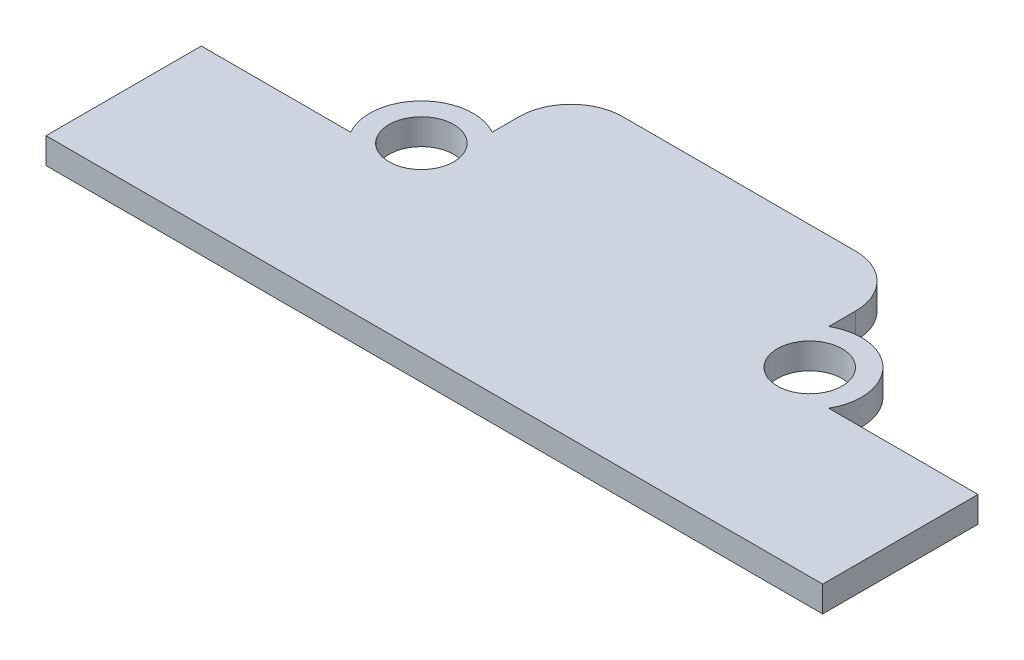
ISO-10303-21;
HEADER;
FILE_DESCRIPTION(('STEP AP214'),'2;1');
FILE_NAME('part.step','',(''),(''),'','','');
FILE_SCHEMA(('AUTOMOTIVE_DESIGN { 1 0 10303 214 1 1 1 1 }'));
ENDSEC;
DATA;
#1=APPLICATION_CONTEXT('core data for automotive mechanical design processes');
#2=APPLICATION_PROTOCOL_DEFINITION('international standard','automotive_design',2000,#1);
#3=PRODUCT_CONTEXT('',#1,'mechanical');
#4=PRODUCT('Part','Part','',(#3));
#5=PRODUCT_RELATED_PRODUCT_CATEGORY('part','',(#4));
#6=PRODUCT_DEFINITION_FORMATION('','',#4);
#7=PRODUCT_DEFINITION_CONTEXT('part definition',#1,'design');
#8=PRODUCT_DEFINITION('design','',#6,#7);
#9=PRODUCT_DEFINITION_SHAPE('','',#8);
#10=(LENGTH_UNIT() NAMED_UNIT(*) SI_UNIT(.MILLI.,.METRE.));
#11=(NAMED_UNIT(*) PLANE_ANGLE_UNIT() SI_UNIT($,.RADIAN.));
#12=(NAMED_UNIT(*) SI_UNIT($,.STERADIAN.) SOLID_ANGLE_UNIT());
#13=UNCERTAINTY_MEASURE_WITH_UNIT(LENGTH_MEASURE(1.E-05),#10,'distance_accuracy_value','');
#14=(GEOMETRIC_REPRESENTATION_CONTEXT(3) GLOBAL_UNCERTAINTY_ASSIGNED_CONTEXT((#13)) GLOBAL_UNIT_ASSIGNED_CONTEXT((#10,
#11,#12)) REPRESENTATION_CONTEXT('',''));
#15=CARTESIAN_POINT('',(0.,0.,0.));
#16=DIRECTION('',(0.,0.,1.));
#17=DIRECTION('',(1.,0.,0.));
#18=AXIS2_PLACEMENT_3D('',#15,#16,#17);
#19=CARTESIAN_POINT('',(0.,1.,0.));
#20=DIRECTION('',(1.,0.,0.));
#21=DIRECTION('',(0.,0.,-1.));
#22=AXIS2_PLACEMENT_3D('',#19,#20,#21);
#23=PLANE('',#22);
#24=DIRECTION('',(0.,0.,1.));
#25=VECTOR('',#24,1.);
#26=CARTESIAN_POINT('',(0.,0.,0.));
#27=LINE('',#26,#25);
#28=CARTESIAN_POINT('',(0.,0.,-6.));
#29=VERTEX_POINT('',#28);
#30=CARTESIAN_POINT('',(0.,0.,0.));
#31=VERTEX_POINT('',#30);
#32=EDGE_CURVE('E213',#29,#31,#27,.T.);
#33=ORIENTED_EDGE('',*,*,#32,.T.);
#34=DIRECTION('',(0.,-1.,0.));
#35=VECTOR('',#34,1.);
#36=CARTESIAN_POINT('',(0.,1.,0.));
#37=LINE('',#36,#35);
#38=CARTESIAN_POINT('',(0.,1.,0.));
#39=VERTEX_POINT('',#38);
#40=EDGE_CURVE('E174',#39,#31,#37,.T.);
#41=ORIENTED_EDGE('',*,*,#40,.F.);
#42=DIRECTION('',(0.,0.,1.));
#43=VECTOR('',#42,1.);
#44=CARTESIAN_POINT('',(0.,1.,0.));
#45=LINE('',#44,#43);
#46=CARTESIAN_POINT('',(0.,1.,-6.));
#47=VERTEX_POINT('',#46);
#48=EDGE_CURVE('E165',#47,#39,#45,.T.);
#49=ORIENTED_EDGE('',*,*,#48,.F.);
#50=DIRECTION('',(0.,-1.,0.));
#51=VECTOR('',#50,1.);
#52=CARTESIAN_POINT('',(0.,1.,-6.));
#53=LINE('',#52,#51);
#54=EDGE_CURVE('E166',#47,#29,#53,.T.);
#55=ORIENTED_EDGE('',*,*,#54,.T.);
#56=EDGE_LOOP('',(#33,#41,#49,#55));
#57=FACE_BOUND('',#56,.T.);
#58=ADVANCED_FACE('F33',(#57),#23,.F.);
#59=CARTESIAN_POINT('',(0.,1.,0.));
#60=DIRECTION('',(0.,0.,-1.));
#61=DIRECTION('',(-1.,0.,0.));
#62=AXIS2_PLACEMENT_3D('',#59,#60,#61);
#63=PLANE('',#62);
#64=DIRECTION('',(1.,0.,0.));
#65=VECTOR('',#64,1.);
#66=CARTESIAN_POINT('',(0.,0.,0.));
#67=LINE('',#66,#65);
#68=CARTESIAN_POINT('',(30.,0.,0.));
#69=VERTEX_POINT('',#68);
#70=EDGE_CURVE('E155',#31,#69,#67,.T.);
#71=ORIENTED_EDGE('',*,*,#70,.T.);
#72=DIRECTION('',(0.,-1.,0.));
#73=VECTOR('',#72,1.);
#74=CARTESIAN_POINT('',(30.,1.,0.));
#75=LINE('',#74,#73);
#76=CARTESIAN_POINT('',(30.,1.,0.));
#77=VERTEX_POINT('',#76);
#78=EDGE_CURVE('E171',#77,#69,#75,.T.);
#79=ORIENTED_EDGE('',*,*,#78,.F.);
#80=DIRECTION('',(1.,0.,0.));
#81=VECTOR('',#80,1.);
#82=CARTESIAN_POINT('',(0.,1.,0.));
#83=LINE('',#82,#81);
#84=EDGE_CURVE('E216',#39,#77,#83,.T.);
#85=ORIENTED_EDGE('',*,*,#84,.F.);
#86=ORIENTED_EDGE('',*,*,#40,.T.);
#87=EDGE_LOOP('',(#71,#79,#85,#86));
#88=FACE_BOUND('',#87,.T.);
#89=ADVANCED_FACE('F228',(#88),#63,.F.);
#90=CARTESIAN_POINT('',(30.,1.,0.));
#91=DIRECTION('',(-1.,0.,0.));
#92=DIRECTION('',(0.,0.,1.));
#93=AXIS2_PLACEMENT_3D('',#90,#91,#92);
#94=PLANE('',#93);
#95=DIRECTION('',(0.,0.,-1.));
#96=VECTOR('',#95,1.);
#97=CARTESIAN_POINT('',(30.,0.,0.));
#98=LINE('',#97,#96);
#99=CARTESIAN_POINT('',(30.,0.,-6.));
#100=VERTEX_POINT('',#99);
#101=EDGE_CURVE('E151',#69,#100,#98,.T.);
#102=ORIENTED_EDGE('',*,*,#101,.T.);
#103=DIRECTION('',(0.,-1.,0.));
#104=VECTOR('',#103,1.);
#105=CARTESIAN_POINT('',(30.,1.,-6.));
#106=LINE('',#105,#104);
#107=CARTESIAN_POINT('',(30.,1.,-6.));
#108=VERTEX_POINT('',#107);
#109=EDGE_CURVE('E150',#108,#100,#106,.T.);
#110=ORIENTED_EDGE('',*,*,#109,.F.);
#111=DIRECTION('',(0.,0.,-1.));
#112=VECTOR('',#111,1.);
#113=CARTESIAN_POINT('',(30.,1.,0.));
#114=LINE('',#113,#112);
#115=EDGE_CURVE('E218',#77,#108,#114,.T.);
#116=ORIENTED_EDGE('',*,*,#115,.F.);
#117=ORIENTED_EDGE('',*,*,#78,.T.);
#118=EDGE_LOOP('',(#102,#110,#116,#117));
#119=FACE_BOUND('',#118,.T.);
#120=ADVANCED_FACE('F233',(#119),#94,.F.);
#121=CARTESIAN_POINT('',(21.5,1.,-6.));
#122=DIRECTION('',(0.,0.,1.));
#123=DIRECTION('',(1.,0.,0.));
#124=AXIS2_PLACEMENT_3D('',#121,#122,#123);
#125=PLANE('',#124);
#126=DIRECTION('',(-1.,0.,0.));
#127=VECTOR('',#126,1.);
#128=CARTESIAN_POINT('',(21.5,0.,-6.));
#129=LINE('',#128,#127);
#130=CARTESIAN_POINT('',(24.2320508075689,0.,-6.));
#131=VERTEX_POINT('',#130);
#132=EDGE_CURVE('E144',#100,#131,#129,.T.);
#133=ORIENTED_EDGE('',*,*,#132,.T.);
#134=DIRECTION('',(0.,1.,0.));
#135=VECTOR('',#134,1.);
#136=CARTESIAN_POINT('',(24.2320508075689,0.,-6.));
#137=LINE('',#136,#135);
#138=CARTESIAN_POINT('',(24.2320508075689,1.,-6.));
#139=VERTEX_POINT('',#138);
#140=EDGE_CURVE('E124',#131,#139,#137,.T.);
#141=ORIENTED_EDGE('',*,*,#140,.T.);
#142=DIRECTION('',(-1.,0.,0.));
#143=VECTOR('',#142,1.);
#144=CARTESIAN_POINT('',(21.5,1.,-6.));
#145=LINE('',#144,#143);
#146=EDGE_CURVE('E220',#108,#139,#145,.T.);
#147=ORIENTED_EDGE('',*,*,#146,.F.);
#148=ORIENTED_EDGE('',*,*,#109,.T.);
#149=EDGE_LOOP('',(#133,#141,#147,#148));
#150=FACE_BOUND('',#149,.T.);
#151=ADVANCED_FACE('F148',(#150),#125,.F.);
#152=CARTESIAN_POINT('',(21.5,1.,-6.));
#153=DIRECTION('',(-1.,0.,0.));
#154=DIRECTION('',(0.,0.,1.));
#155=AXIS2_PLACEMENT_3D('',#152,#153,#154);
#156=PLANE('',#155);
#157=DIRECTION('',(0.,0.,-1.));
#158=VECTOR('',#157,1.);
#159=CARTESIAN_POINT('',(21.5,0.,-6.));
#160=LINE('',#159,#158);
#161=CARTESIAN_POINT('',(21.5,0.,-8.73205080756888));
#162=VERTEX_POINT('',#161);
#163=CARTESIAN_POINT('',(21.5,0.,-9.77501932466479));
#164=VERTEX_POINT('',#163);
#165=EDGE_CURVE('E145',#162,#164,#160,.T.);
#166=ORIENTED_EDGE('',*,*,#165,.T.);
#167=DIRECTION('',(0.,-1.,0.));
#168=VECTOR('',#167,1.);
#169=CARTESIAN_POINT('',(21.5,1.,-9.77501932466479));
#170=LINE('',#169,#168);
#171=CARTESIAN_POINT('',(21.5,1.,-9.77501932466479));
#172=VERTEX_POINT('',#171);
#173=EDGE_CURVE('E56',#164,#172,#170,.F.);
#174=ORIENTED_EDGE('',*,*,#173,.T.);
#175=DIRECTION('',(0.,0.,-1.));
#176=VECTOR('',#175,1.);
#177=CARTESIAN_POINT('',(21.5,1.,-6.));
#178=LINE('',#177,#176);
#179=CARTESIAN_POINT('',(21.5,1.,-8.73205080756888));
#180=VERTEX_POINT('',#179);
#181=EDGE_CURVE('E191',#180,#172,#178,.T.);
#182=ORIENTED_EDGE('',*,*,#181,.F.);
#183=DIRECTION('',(0.,1.,0.));
#184=VECTOR('',#183,1.);
#185=CARTESIAN_POINT('',(21.5,0.,-8.73205080756888));
#186=LINE('',#185,#184);
#187=EDGE_CURVE('E136',#180,#162,#186,.F.);
#188=ORIENTED_EDGE('',*,*,#187,.T.);
#189=EDGE_LOOP('',(#166,#174,#182,#188));
#190=FACE_BOUND('',#189,.T.);
#191=ADVANCED_FACE('F200',(#190),#156,.F.);
#192=CARTESIAN_POINT('',(8.5,1.,-11.7750193246648));
#193=DIRECTION('',(0.,0.,1.));
#194=DIRECTION('',(1.,0.,0.));
#195=AXIS2_PLACEMENT_3D('',#192,#193,#194);
#196=PLANE('',#195);
#197=DIRECTION('',(-1.,0.,0.));
#198=VECTOR('',#197,1.);
#199=CARTESIAN_POINT('',(8.5,1.,-11.7750193246648));
#200=LINE('',#199,#198);
#201=CARTESIAN_POINT('',(19.5,1.,-11.7750193246648));
#202=VERTEX_POINT('',#201);
#203=CARTESIAN_POINT('',(10.5,1.,-11.7750193246648));
#204=VERTEX_POINT('',#203);
#205=EDGE_CURVE('E190',#202,#204,#200,.T.);
#206=ORIENTED_EDGE('',*,*,#205,.F.);
#207=DIRECTION('',(0.,-1.,0.));
#208=VECTOR('',#207,1.);
#209=CARTESIAN_POINT('',(19.5,1.,-11.7750193246648));
#210=LINE('',#209,#208);
#211=CARTESIAN_POINT('',(19.5,0.,-11.7750193246648));
#212=VERTEX_POINT('',#211);
#213=EDGE_CURVE('E179',#202,#212,#210,.T.);
#214=ORIENTED_EDGE('',*,*,#213,.T.);
#215=DIRECTION('',(-1.,0.,0.));
#216=VECTOR('',#215,1.);
#217=CARTESIAN_POINT('',(8.5,0.,-11.7750193246648));
#218=LINE('',#217,#216);
#219=CARTESIAN_POINT('',(10.5,0.,-11.7750193246648));
#220=VERTEX_POINT('',#219);
#221=EDGE_CURVE('E153',#212,#220,#218,.T.);
#222=ORIENTED_EDGE('',*,*,#221,.T.);
#223=DIRECTION('',(0.,-1.,0.));
#224=VECTOR('',#223,1.);
#225=CARTESIAN_POINT('',(10.5,1.,-11.7750193246648));
#226=LINE('',#225,#224);
#227=EDGE_CURVE('E177',#220,#204,#226,.F.);
#228=ORIENTED_EDGE('',*,*,#227,.T.);
#229=EDGE_LOOP('',(#206,#214,#222,#228));
#230=FACE_BOUND('',#229,.T.);
#231=ADVANCED_FACE('F195',(#230),#196,.F.);
#232=CARTESIAN_POINT('',(8.5,1.,-6.));
#233=DIRECTION('',(1.,0.,0.));
#234=DIRECTION('',(0.,0.,-1.));
#235=AXIS2_PLACEMENT_3D('',#232,#233,#234);
#236=PLANE('',#235);
#237=DIRECTION('',(0.,0.,1.));
#238=VECTOR('',#237,1.);
#239=CARTESIAN_POINT('',(8.5,1.,-6.));
#240=LINE('',#239,#238);
#241=CARTESIAN_POINT('',(8.5,1.,-9.77501932466479));
#242=VERTEX_POINT('',#241);
#243=CARTESIAN_POINT('',(8.5,1.,-8.73205080756887));
#244=VERTEX_POINT('',#243);
#245=EDGE_CURVE('E197',#242,#244,#240,.T.);
#246=ORIENTED_EDGE('',*,*,#245,.F.);
#247=DIRECTION('',(0.,-1.,0.));
#248=VECTOR('',#247,1.);
#249=CARTESIAN_POINT('',(8.5,1.,-9.77501932466479));
#250=LINE('',#249,#248);
#251=CARTESIAN_POINT('',(8.5,0.,-9.77501932466479));
#252=VERTEX_POINT('',#251);
#253=EDGE_CURVE('E11',#242,#252,#250,.T.);
#254=ORIENTED_EDGE('',*,*,#253,.T.);
#255=DIRECTION('',(0.,0.,1.));
#256=VECTOR('',#255,1.);
#257=CARTESIAN_POINT('',(8.5,0.,-6.));
#258=LINE('',#257,#256);
#259=CARTESIAN_POINT('',(8.5,0.,-8.73205080756887));
#260=VERTEX_POINT('',#259);
#261=EDGE_CURVE('E161',#252,#260,#258,.T.);
#262=ORIENTED_EDGE('',*,*,#261,.T.);
#263=DIRECTION('',(0.,1.,0.));
#264=VECTOR('',#263,1.);
#265=CARTESIAN_POINT('',(8.5,0.,-8.73205080756887));
#266=LINE('',#265,#264);
#267=EDGE_CURVE('E210',#260,#244,#266,.T.);
#268=ORIENTED_EDGE('',*,*,#267,.T.);
#269=EDGE_LOOP('',(#246,#254,#262,#268));
#270=FACE_BOUND('',#269,.T.);
#271=ADVANCED_FACE('F249',(#270),#236,.F.);
#272=CARTESIAN_POINT('',(0.,1.,-6.));
#273=DIRECTION('',(0.,0.,1.));
#274=DIRECTION('',(1.,0.,0.));
#275=AXIS2_PLACEMENT_3D('',#272,#273,#274);
#276=PLANE('',#275);
#277=DIRECTION('',(-1.,0.,0.));
#278=VECTOR('',#277,1.);
#279=CARTESIAN_POINT('',(0.,1.,-6.));
#280=LINE('',#279,#278);
#281=CARTESIAN_POINT('',(5.76794919243112,1.,-6.));
#282=VERTEX_POINT('',#281);
#283=EDGE_CURVE('E169',#282,#47,#280,.T.);
#284=ORIENTED_EDGE('',*,*,#283,.F.);
#285=DIRECTION('',(0.,1.,0.));
#286=VECTOR('',#285,1.);
#287=CARTESIAN_POINT('',(5.76794919243112,0.,-6.));
#288=LINE('',#287,#286);
#289=CARTESIAN_POINT('',(5.76794919243112,0.,-6.));
#290=VERTEX_POINT('',#289);
#291=EDGE_CURVE('E206',#282,#290,#288,.F.);
#292=ORIENTED_EDGE('',*,*,#291,.T.);
#293=DIRECTION('',(-1.,0.,0.));
#294=VECTOR('',#293,1.);
#295=CARTESIAN_POINT('',(0.,0.,-6.));
#296=LINE('',#295,#294);
#297=EDGE_CURVE('E163',#290,#29,#296,.T.);
#298=ORIENTED_EDGE('',*,*,#297,.T.);
#299=ORIENTED_EDGE('',*,*,#54,.F.);
#300=EDGE_LOOP('',(#284,#292,#298,#299));
#301=FACE_BOUND('',#300,.T.);
#302=ADVANCED_FACE('F242',(#301),#276,.F.);
#303=CARTESIAN_POINT('',(0.,1.,0.));
#304=DIRECTION('',(0.,-1.,0.));
#305=DIRECTION('',(0.,0.,-1.));
#306=AXIS2_PLACEMENT_3D('',#303,#304,#305);
#307=PLANE('',#306);
#308=CARTESIAN_POINT('',(22.5,1.,-7.));
#309=DIRECTION('',(0.,1.,0.));
#310=DIRECTION('',(0.,0.,1.));
#311=AXIS2_PLACEMENT_3D('',#308,#309,#310);
#312=CIRCLE('',#311,1.25);
#313=CARTESIAN_POINT('',(22.5,1.,-5.75));
#314=VERTEX_POINT('',#313);
#315=EDGE_CURVE('E300',#314,#314,#312,.T.);
#316=ORIENTED_EDGE('',*,*,#315,.F.);
#317=EDGE_LOOP('',(#316));
#318=FACE_BOUND('',#317,.T.);
#319=CARTESIAN_POINT('',(7.5,1.,-7.));
#320=DIRECTION('',(0.,1.,0.));
#321=DIRECTION('',(0.,0.,1.));
#322=AXIS2_PLACEMENT_3D('',#319,#320,#321);
#323=CIRCLE('',#322,1.25);
#324=CARTESIAN_POINT('',(7.5,1.,-5.75));
#325=VERTEX_POINT('',#324);
#326=EDGE_CURVE('E302',#325,#325,#323,.T.);
#327=ORIENTED_EDGE('',*,*,#326,.F.);
#328=EDGE_LOOP('',(#327));
#329=FACE_BOUND('',#328,.T.);
#330=ORIENTED_EDGE('',*,*,#181,.T.);
#331=CARTESIAN_POINT('',(19.5,1.,-9.77501932466479));
#332=DIRECTION('',(0.,-1.,0.));
#333=DIRECTION('',(0.,0.,-1.));
#334=AXIS2_PLACEMENT_3D('',#331,#332,#333);
#335=CIRCLE('',#334,2.);
#336=EDGE_CURVE('E41',#172,#202,#335,.F.);
#337=ORIENTED_EDGE('',*,*,#336,.T.);
#338=ORIENTED_EDGE('',*,*,#205,.T.);
#339=CARTESIAN_POINT('',(10.5,1.,-9.77501932466479));
#340=DIRECTION('',(0.,-1.,0.));
#341=DIRECTION('',(0.,0.,-1.));
#342=AXIS2_PLACEMENT_3D('',#339,#340,#341);
#343=CIRCLE('',#342,2.);
#344=EDGE_CURVE('E48',#204,#242,#343,.F.);
#345=ORIENTED_EDGE('',*,*,#344,.T.);
#346=ORIENTED_EDGE('',*,*,#245,.T.);
#347=CARTESIAN_POINT('',(7.5,1.,-7.));
#348=DIRECTION('',(0.,1.,0.));
#349=DIRECTION('',(0.,0.,1.));
#350=AXIS2_PLACEMENT_3D('',#347,#348,#349);
#351=CIRCLE('',#350,2.);
#352=EDGE_CURVE('E135',#244,#282,#351,.T.);
#353=ORIENTED_EDGE('',*,*,#352,.T.);
#354=ORIENTED_EDGE('',*,*,#283,.T.);
#355=ORIENTED_EDGE('',*,*,#48,.T.);
#356=ORIENTED_EDGE('',*,*,#84,.T.);
#357=ORIENTED_EDGE('',*,*,#115,.T.);
#358=ORIENTED_EDGE('',*,*,#146,.T.);
#359=CARTESIAN_POINT('',(22.5,1.,-7.));
#360=DIRECTION('',(0.,1.,0.));
#361=DIRECTION('',(0.,0.,1.));
#362=AXIS2_PLACEMENT_3D('',#359,#360,#361);
#363=CIRCLE('',#362,2.);
#364=EDGE_CURVE('E130',#139,#180,#363,.T.);
#365=ORIENTED_EDGE('',*,*,#364,.T.);
#366=EDGE_LOOP('',(#330,#337,#338,#345,#346,#353,#354,#355,#356,#357,#358,#365));
#367=FACE_BOUND('',#366,.T.);
#368=ADVANCED_FACE('F189',(#318,#329,#367),#307,.F.);
#369=CARTESIAN_POINT('',(0.,0.,0.));
#370=DIRECTION('',(0.,-1.,0.));
#371=DIRECTION('',(0.,0.,-1.));
#372=AXIS2_PLACEMENT_3D('',#369,#370,#371);
#373=PLANE('',#372);
#374=CARTESIAN_POINT('',(22.5,0.,-7.));
#375=DIRECTION('',(0.,1.,0.));
#376=DIRECTION('',(0.,0.,1.));
#377=AXIS2_PLACEMENT_3D('',#374,#375,#376);
#378=CIRCLE('',#377,1.25);
#379=CARTESIAN_POINT('',(22.5,0.,-5.75));
#380=VERTEX_POINT('',#379);
#381=EDGE_CURVE('E297',#380,#380,#378,.T.);
#382=ORIENTED_EDGE('',*,*,#381,.T.);
#383=EDGE_LOOP('',(#382));
#384=FACE_BOUND('',#383,.T.);
#385=CARTESIAN_POINT('',(7.5,0.,-7.));
#386=DIRECTION('',(0.,1.,0.));
#387=DIRECTION('',(0.,0.,1.));
#388=AXIS2_PLACEMENT_3D('',#385,#386,#387);
#389=CIRCLE('',#388,1.25);
#390=CARTESIAN_POINT('',(7.5,0.,-5.75));
#391=VERTEX_POINT('',#390);
#392=EDGE_CURVE('E305',#391,#391,#389,.T.);
#393=ORIENTED_EDGE('',*,*,#392,.T.);
#394=EDGE_LOOP('',(#393));
#395=FACE_BOUND('',#394,.T.);
#396=ORIENTED_EDGE('',*,*,#221,.F.);
#397=CARTESIAN_POINT('',(19.5,0.,-9.77501932466479));
#398=DIRECTION('',(0.,-1.,0.));
#399=DIRECTION('',(0.,0.,-1.));
#400=AXIS2_PLACEMENT_3D('',#397,#398,#399);
#401=CIRCLE('',#400,2.);
#402=EDGE_CURVE('E184',#212,#164,#401,.T.);
#403=ORIENTED_EDGE('',*,*,#402,.T.);
#404=ORIENTED_EDGE('',*,*,#165,.F.);
#405=CARTESIAN_POINT('',(22.5,0.,-7.));
#406=DIRECTION('',(0.,1.,0.));
#407=DIRECTION('',(0.,0.,1.));
#408=AXIS2_PLACEMENT_3D('',#405,#406,#407);
#409=CIRCLE('',#408,2.);
#410=EDGE_CURVE('E128',#131,#162,#409,.T.);
#411=ORIENTED_EDGE('',*,*,#410,.F.);
#412=ORIENTED_EDGE('',*,*,#132,.F.);
#413=ORIENTED_EDGE('',*,*,#101,.F.);
#414=ORIENTED_EDGE('',*,*,#70,.F.);
#415=ORIENTED_EDGE('',*,*,#32,.F.);
#416=ORIENTED_EDGE('',*,*,#297,.F.);
#417=CARTESIAN_POINT('',(7.5,0.,-7.));
#418=DIRECTION('',(0.,1.,0.));
#419=DIRECTION('',(0.,0.,1.));
#420=AXIS2_PLACEMENT_3D('',#417,#418,#419);
#421=CIRCLE('',#420,2.);
#422=EDGE_CURVE('E204',#260,#290,#421,.T.);
#423=ORIENTED_EDGE('',*,*,#422,.F.);
#424=ORIENTED_EDGE('',*,*,#261,.F.);
#425=CARTESIAN_POINT('',(10.5,0.,-9.77501932466479));
#426=DIRECTION('',(0.,-1.,0.));
#427=DIRECTION('',(0.,0.,-1.));
#428=AXIS2_PLACEMENT_3D('',#425,#426,#427);
#429=CIRCLE('',#428,2.);
#430=EDGE_CURVE('E182',#252,#220,#429,.T.);
#431=ORIENTED_EDGE('',*,*,#430,.T.);
#432=EDGE_LOOP('',(#396,#403,#404,#411,#412,#413,#414,#415,#416,#423,#424,#431));
#433=FACE_BOUND('',#432,.T.);
#434=ADVANCED_FACE('F142',(#384,#395,#433),#373,.T.);
#435=CARTESIAN_POINT('',(7.5,0.,-7.));
#436=DIRECTION('',(0.,1.,0.));
#437=DIRECTION('',(0.,0.,1.));
#438=AXIS2_PLACEMENT_3D('',#435,#436,#437);
#439=CYLINDRICAL_SURFACE('',#438,2.);
#440=ORIENTED_EDGE('',*,*,#267,.F.);
#441=ORIENTED_EDGE('',*,*,#422,.T.);
#442=ORIENTED_EDGE('',*,*,#291,.F.);
#443=ORIENTED_EDGE('',*,*,#352,.F.);
#444=EDGE_LOOP('',(#440,#441,#442,#443));
#445=FACE_BOUND('',#444,.T.);
#446=ADVANCED_FACE('F247',(#445),#439,.T.);
#447=CARTESIAN_POINT('',(22.5,0.,-7.));
#448=DIRECTION('',(0.,1.,0.));
#449=DIRECTION('',(0.,0.,1.));
#450=AXIS2_PLACEMENT_3D('',#447,#448,#449);
#451=CYLINDRICAL_SURFACE('',#450,2.);
#452=ORIENTED_EDGE('',*,*,#140,.F.);
#453=ORIENTED_EDGE('',*,*,#410,.T.);
#454=ORIENTED_EDGE('',*,*,#187,.F.);
#455=ORIENTED_EDGE('',*,*,#364,.F.);
#456=EDGE_LOOP('',(#452,#453,#454,#455));
#457=FACE_BOUND('',#456,.T.);
#458=ADVANCED_FACE('F126',(#457),#451,.T.);
#459=CARTESIAN_POINT('',(7.5,0.,-7.));
#460=DIRECTION('',(0.,1.,0.));
#461=DIRECTION('',(0.,0.,1.));
#462=AXIS2_PLACEMENT_3D('',#459,#460,#461);
#463=CYLINDRICAL_SURFACE('',#462,1.25);
#464=ORIENTED_EDGE('',*,*,#392,.F.);
#465=EDGE_LOOP('',(#464));
#466=FACE_BOUND('',#465,.T.);
#467=ORIENTED_EDGE('',*,*,#326,.T.);
#468=EDGE_LOOP('',(#467));
#469=FACE_BOUND('',#468,.T.);
#470=ADVANCED_FACE('F286',(#466,#469),#463,.F.);
#471=CARTESIAN_POINT('',(22.5,0.,-7.));
#472=DIRECTION('',(0.,1.,0.));
#473=DIRECTION('',(0.,0.,1.));
#474=AXIS2_PLACEMENT_3D('',#471,#472,#473);
#475=CYLINDRICAL_SURFACE('',#474,1.25);
#476=ORIENTED_EDGE('',*,*,#381,.F.);
#477=EDGE_LOOP('',(#476));
#478=FACE_BOUND('',#477,.T.);
#479=ORIENTED_EDGE('',*,*,#315,.T.);
#480=EDGE_LOOP('',(#479));
#481=FACE_BOUND('',#480,.T.);
#482=ADVANCED_FACE('F256',(#478,#481),#475,.F.);
#483=CARTESIAN_POINT('',(19.5,1.,-9.77501932466479));
#484=DIRECTION('',(0.,-1.,0.));
#485=DIRECTION('',(0.,0.,-1.));
#486=AXIS2_PLACEMENT_3D('',#483,#484,#485);
#487=CYLINDRICAL_SURFACE('',#486,2.);
#488=ORIENTED_EDGE('',*,*,#336,.F.);
#489=ORIENTED_EDGE('',*,*,#173,.F.);
#490=ORIENTED_EDGE('',*,*,#402,.F.);
#491=ORIENTED_EDGE('',*,*,#213,.F.);
#492=EDGE_LOOP('',(#488,#489,#490,#491));
#493=FACE_BOUND('',#492,.T.);
#494=ADVANCED_FACE('F199',(#493),#487,.T.);
#495=CARTESIAN_POINT('',(10.5,1.,-9.77501932466479));
#496=DIRECTION('',(0.,-1.,0.));
#497=DIRECTION('',(0.,0.,-1.));
#498=AXIS2_PLACEMENT_3D('',#495,#496,#497);
#499=CYLINDRICAL_SURFACE('',#498,2.);
#500=ORIENTED_EDGE('',*,*,#344,.F.);
#501=ORIENTED_EDGE('',*,*,#227,.F.);
#502=ORIENTED_EDGE('',*,*,#430,.F.);
#503=ORIENTED_EDGE('',*,*,#253,.F.);
#504=EDGE_LOOP('',(#500,#501,#502,#503));
#505=FACE_BOUND('',#504,.T.);
#506=ADVANCED_FACE('F35',(#505),#499,.T.);
#507=CLOSED_SHELL('',(#58,#89,#120,#151,#191,#231,#271,#302,#368,#434,#446,#458,#470,#482,#494,#506));
#508=MANIFOLD_SOLID_BREP('B2',#507);
#509=ADVANCED_BREP_SHAPE_REPRESENTATION('',(#18,#508),#14);
#510=SHAPE_DEFINITION_REPRESENTATION(#9,#509);
ENDSEC;
END-ISO-10303-21;
